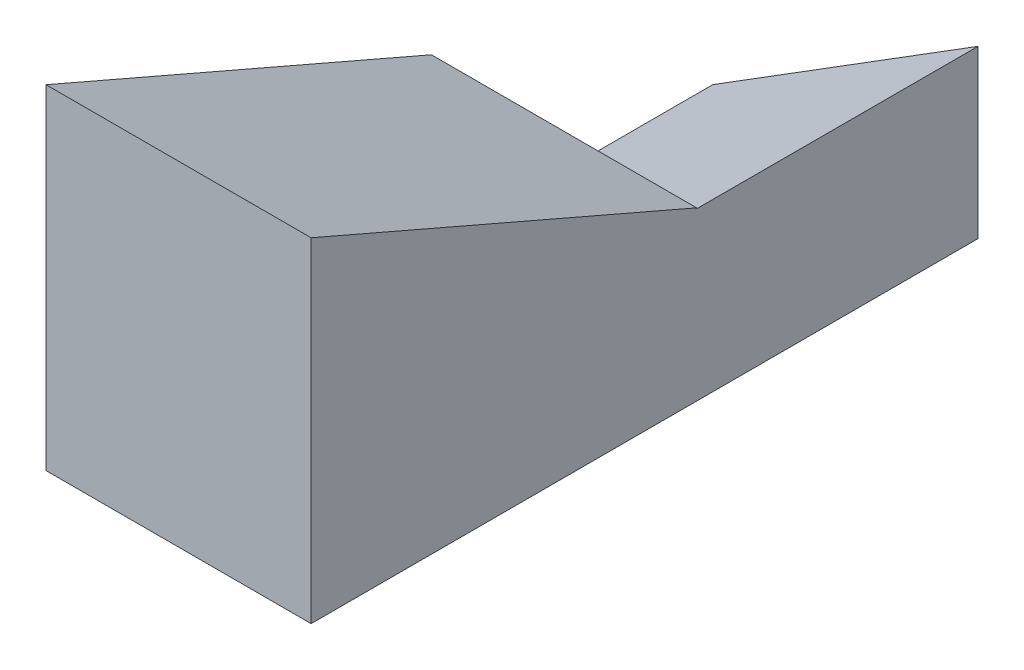
ISO-10303-21;
HEADER;
FILE_DESCRIPTION(('STEP AP214'),'2;1');
FILE_NAME('part.step','',(''),(''),'','','');
FILE_SCHEMA(('AUTOMOTIVE_DESIGN { 1 0 10303 214 1 1 1 1 }'));
ENDSEC;
DATA;
#1=APPLICATION_CONTEXT('core data for automotive mechanical design processes');
#2=APPLICATION_PROTOCOL_DEFINITION('international standard','automotive_design',2000,#1);
#3=PRODUCT_CONTEXT('',#1,'mechanical');
#4=PRODUCT('Part','Part','',(#3));
#5=PRODUCT_RELATED_PRODUCT_CATEGORY('part','',(#4));
#6=PRODUCT_DEFINITION_FORMATION('','',#4);
#7=PRODUCT_DEFINITION_CONTEXT('part definition',#1,'design');
#8=PRODUCT_DEFINITION('design','',#6,#7);
#9=PRODUCT_DEFINITION_SHAPE('','',#8);
#10=(LENGTH_UNIT() NAMED_UNIT(*) SI_UNIT(.MILLI.,.METRE.));
#11=(NAMED_UNIT(*) PLANE_ANGLE_UNIT() SI_UNIT($,.RADIAN.));
#12=(NAMED_UNIT(*) SI_UNIT($,.STERADIAN.) SOLID_ANGLE_UNIT());
#13=UNCERTAINTY_MEASURE_WITH_UNIT(LENGTH_MEASURE(1.E-05),#10,'distance_accuracy_value','');
#14=(GEOMETRIC_REPRESENTATION_CONTEXT(3) GLOBAL_UNCERTAINTY_ASSIGNED_CONTEXT((#13)) GLOBAL_UNIT_ASSIGNED_CONTEXT((#10,
#11,#12)) REPRESENTATION_CONTEXT('',''));
#15=CARTESIAN_POINT('',(0.,0.,0.));
#16=DIRECTION('',(0.,0.,1.));
#17=DIRECTION('',(1.,0.,0.));
#18=AXIS2_PLACEMENT_3D('',#15,#16,#17);
#19=CARTESIAN_POINT('',(0.,0.,0.));
#20=DIRECTION('',(0.,1.,0.));
#21=DIRECTION('',(0.,0.,1.));
#22=AXIS2_PLACEMENT_3D('',#19,#20,#21);
#23=PLANE('',#22);
#24=DIRECTION('',(1.,0.,0.));
#25=VECTOR('',#24,1.);
#26=CARTESIAN_POINT('',(22.3,0.,-54.8000000000001));
#27=LINE('',#26,#25);
#28=CARTESIAN_POINT('',(-17.3,0.,-54.8000000000001));
#29=VERTEX_POINT('',#28);
#30=CARTESIAN_POINT('',(22.3,0.,-54.8000000000001));
#31=VERTEX_POINT('',#30);
#32=EDGE_CURVE('E116',#29,#31,#27,.T.);
#33=ORIENTED_EDGE('',*,*,#32,.T.);
#34=DIRECTION('',(0.,0.,1.));
#35=VECTOR('',#34,1.);
#36=CARTESIAN_POINT('',(22.3,0.,44.7999999999999));
#37=LINE('',#36,#35);
#38=CARTESIAN_POINT('',(22.3,0.,44.7999999999999));
#39=VERTEX_POINT('',#38);
#40=EDGE_CURVE('E114',#31,#39,#37,.T.);
#41=ORIENTED_EDGE('',*,*,#40,.T.);
#42=DIRECTION('',(-1.,0.,0.));
#43=VECTOR('',#42,1.);
#44=CARTESIAN_POINT('',(-17.3,0.,44.7999999999999));
#45=LINE('',#44,#43);
#46=CARTESIAN_POINT('',(-17.3,0.,44.7999999999999));
#47=VERTEX_POINT('',#46);
#48=EDGE_CURVE('E63',#39,#47,#45,.T.);
#49=ORIENTED_EDGE('',*,*,#48,.T.);
#50=DIRECTION('',(0.,0.,-1.));
#51=VECTOR('',#50,1.);
#52=CARTESIAN_POINT('',(-17.3,0.,-54.8000000000001));
#53=LINE('',#52,#51);
#54=EDGE_CURVE('E104',#47,#29,#53,.T.);
#55=ORIENTED_EDGE('',*,*,#54,.T.);
#56=EDGE_LOOP('',(#33,#41,#49,#55));
#57=FACE_BOUND('',#56,.T.);
#58=ADVANCED_FACE('F38',(#57),#23,.F.);
#59=CARTESIAN_POINT('',(22.3,50.,-54.8000000000001));
#60=DIRECTION('',(0.,0.,-1.));
#61=DIRECTION('',(-1.,0.,0.));
#62=AXIS2_PLACEMENT_3D('',#59,#60,#61);
#63=PLANE('',#62);
#64=DIRECTION('',(0.,-1.,0.));
#65=VECTOR('',#64,1.);
#66=CARTESIAN_POINT('',(22.3,50.,-54.8000000000001));
#67=LINE('',#66,#65);
#68=CARTESIAN_POINT('',(22.3,24.875,-54.8000000000001));
#69=VERTEX_POINT('',#68);
#70=EDGE_CURVE('E110',#69,#31,#67,.T.);
#71=ORIENTED_EDGE('',*,*,#70,.T.);
#72=ORIENTED_EDGE('',*,*,#32,.F.);
#73=DIRECTION('',(0.,-1.,0.));
#74=VECTOR('',#73,1.);
#75=CARTESIAN_POINT('',(-17.3,50.,-54.8000000000001));
#76=LINE('',#75,#74);
#77=CARTESIAN_POINT('',(-17.3,0.125,-54.8000000000001));
#78=VERTEX_POINT('',#77);
#79=EDGE_CURVE('E100',#78,#29,#76,.T.);
#80=ORIENTED_EDGE('',*,*,#79,.F.);
#81=DIRECTION('',(-0.847998304005088,-0.52999894000318,0.));
#82=VECTOR('',#81,1.);
#83=CARTESIAN_POINT('',(-4.91573033707866,7.86516853932586,-54.8000000000001));
#84=LINE('',#83,#82);
#85=EDGE_CURVE('E135',#69,#78,#84,.T.);
#86=ORIENTED_EDGE('',*,*,#85,.F.);
#87=EDGE_LOOP('',(#71,#72,#80,#86));
#88=FACE_BOUND('',#87,.T.);
#89=ADVANCED_FACE('F161',(#88),#63,.T.);
#90=CARTESIAN_POINT('',(-17.3,50.,-54.8000000000001));
#91=DIRECTION('',(-1.,0.,0.));
#92=DIRECTION('',(0.,0.,1.));
#93=AXIS2_PLACEMENT_3D('',#90,#91,#92);
#94=PLANE('',#93);
#95=DIRECTION('',(0.,1.,0.));
#96=VECTOR('',#95,1.);
#97=CARTESIAN_POINT('',(-17.3,0.,-12.7716000000001));
#98=LINE('',#97,#96);
#99=CARTESIAN_POINT('',(-17.3,0.124999999999998,-12.7716000000001));
#100=VERTEX_POINT('',#99);
#101=CARTESIAN_POINT('',(-17.3,25.,-12.7716000000001));
#102=VERTEX_POINT('',#101);
#103=EDGE_CURVE('E137',#100,#102,#98,.T.);
#104=ORIENTED_EDGE('',*,*,#103,.F.);
#105=DIRECTION('',(0.,0.,1.));
#106=VECTOR('',#105,1.);
#107=CARTESIAN_POINT('',(-17.3,0.124999999999998,-12.7716000000001));
#108=LINE('',#107,#106);
#109=EDGE_CURVE('E136',#78,#100,#108,.T.);
#110=ORIENTED_EDGE('',*,*,#109,.F.);
#111=ORIENTED_EDGE('',*,*,#79,.T.);
#112=ORIENTED_EDGE('',*,*,#54,.F.);
#113=DIRECTION('',(0.,-1.,0.));
#114=VECTOR('',#113,1.);
#115=CARTESIAN_POINT('',(-17.3,50.,44.7999999999999));
#116=LINE('',#115,#114);
#117=CARTESIAN_POINT('',(-17.3,49.9134522715504,44.7999999999999));
#118=VERTEX_POINT('',#117);
#119=EDGE_CURVE('E93',#118,#47,#116,.T.);
#120=ORIENTED_EDGE('',*,*,#119,.F.);
#121=DIRECTION('',(0.,-0.397147890634787,-0.917754625683979));
#122=VECTOR('',#121,1.);
#123=CARTESIAN_POINT('',(-17.3,24.9786670611837,-12.8208888600001));
#124=LINE('',#123,#122);
#125=EDGE_CURVE('E132',#102,#118,#124,.F.);
#126=ORIENTED_EDGE('',*,*,#125,.F.);
#127=EDGE_LOOP('',(#104,#110,#111,#112,#120,#126));
#128=FACE_BOUND('',#127,.T.);
#129=ADVANCED_FACE('F105',(#128),#94,.T.);
#130=CARTESIAN_POINT('',(-17.3,50.,44.7999999999999));
#131=DIRECTION('',(0.,0.,1.));
#132=DIRECTION('',(1.,0.,0.));
#133=AXIS2_PLACEMENT_3D('',#130,#131,#132);
#134=PLANE('',#133);
#135=ORIENTED_EDGE('',*,*,#119,.T.);
#136=ORIENTED_EDGE('',*,*,#48,.F.);
#137=DIRECTION('',(0.,-1.,0.));
#138=VECTOR('',#137,1.);
#139=CARTESIAN_POINT('',(22.3,50.,44.7999999999999));
#140=LINE('',#139,#138);
#141=CARTESIAN_POINT('',(22.3,49.9134522715505,44.7999999999999));
#142=VERTEX_POINT('',#141);
#143=EDGE_CURVE('E101',#142,#39,#140,.T.);
#144=ORIENTED_EDGE('',*,*,#143,.F.);
#145=DIRECTION('',(-1.,0.,0.));
#146=VECTOR('',#145,1.);
#147=CARTESIAN_POINT('',(0.,49.9134522715504,44.7999999999999));
#148=LINE('',#147,#146);
#149=EDGE_CURVE('E97',#118,#142,#148,.F.);
#150=ORIENTED_EDGE('',*,*,#149,.F.);
#151=EDGE_LOOP('',(#135,#136,#144,#150));
#152=FACE_BOUND('',#151,.T.);
#153=ADVANCED_FACE('F95',(#152),#134,.T.);
#154=CARTESIAN_POINT('',(22.3,50.,44.7999999999999));
#155=DIRECTION('',(1.,0.,0.));
#156=DIRECTION('',(0.,0.,-1.));
#157=AXIS2_PLACEMENT_3D('',#154,#155,#156);
#158=PLANE('',#157);
#159=ORIENTED_EDGE('',*,*,#143,.T.);
#160=ORIENTED_EDGE('',*,*,#40,.F.);
#161=ORIENTED_EDGE('',*,*,#70,.F.);
#162=DIRECTION('',(0.,0.,-1.));
#163=VECTOR('',#162,1.);
#164=CARTESIAN_POINT('',(22.3,24.875,-12.7716000000001));
#165=LINE('',#164,#163);
#166=CARTESIAN_POINT('',(22.3,24.875,-12.7716000000001));
#167=VERTEX_POINT('',#166);
#168=EDGE_CURVE('E55',#167,#69,#165,.T.);
#169=ORIENTED_EDGE('',*,*,#168,.F.);
#170=DIRECTION('',(0.,-1.,0.));
#171=VECTOR('',#170,1.);
#172=CARTESIAN_POINT('',(22.3,0.,-12.7716000000001));
#173=LINE('',#172,#171);
#174=CARTESIAN_POINT('',(22.3,25.,-12.7716000000001));
#175=VERTEX_POINT('',#174);
#176=EDGE_CURVE('E120',#175,#167,#173,.T.);
#177=ORIENTED_EDGE('',*,*,#176,.F.);
#178=DIRECTION('',(0.,0.397147890634787,0.917754625683979));
#179=VECTOR('',#178,1.);
#180=CARTESIAN_POINT('',(22.3,24.9786670611837,-12.8208888600001));
#181=LINE('',#180,#179);
#182=EDGE_CURVE('E130',#142,#175,#181,.F.);
#183=ORIENTED_EDGE('',*,*,#182,.F.);
#184=EDGE_LOOP('',(#159,#160,#161,#169,#177,#183));
#185=FACE_BOUND('',#184,.T.);
#186=ADVANCED_FACE('F155',(#185),#158,.T.);
#187=CARTESIAN_POINT('',(0.,24.9786670611837,-12.8208888600001));
#188=DIRECTION('',(0.,-0.917754625683978,0.397147890634787));
#189=DIRECTION('',(1.,0.,0.));
#190=AXIS2_PLACEMENT_3D('',#187,#188,#189);
#191=PLANE('',#190);
#192=DIRECTION('',(-1.,0.,0.));
#193=VECTOR('',#192,1.);
#194=CARTESIAN_POINT('',(0.,25.,-12.7715913470591));
#195=LINE('',#194,#193);
#196=EDGE_CURVE('E11',#102,#175,#195,.F.);
#197=ORIENTED_EDGE('',*,*,#196,.F.);
#198=ORIENTED_EDGE('',*,*,#125,.T.);
#199=ORIENTED_EDGE('',*,*,#149,.T.);
#200=ORIENTED_EDGE('',*,*,#182,.T.);
#201=EDGE_LOOP('',(#197,#198,#199,#200));
#202=FACE_BOUND('',#201,.T.);
#203=ADVANCED_FACE('F41',(#202),#191,.F.);
#204=CARTESIAN_POINT('',(-4.91573033707866,7.86516853932586,-12.7716000000001));
#205=DIRECTION('',(-0.52999894000318,0.847998304005088,0.));
#206=DIRECTION('',(-0.847998304005088,-0.52999894000318,0.));
#207=AXIS2_PLACEMENT_3D('',#204,#205,#206);
#208=PLANE('',#207);
#209=ORIENTED_EDGE('',*,*,#85,.T.);
#210=ORIENTED_EDGE('',*,*,#109,.T.);
#211=DIRECTION('',(0.847998304005088,0.52999894000318,0.));
#212=VECTOR('',#211,1.);
#213=CARTESIAN_POINT('',(-4.91573033707866,7.86516853932586,-12.7716000000001));
#214=LINE('',#213,#212);
#215=EDGE_CURVE('E48',#100,#167,#214,.T.);
#216=ORIENTED_EDGE('',*,*,#215,.T.);
#217=ORIENTED_EDGE('',*,*,#168,.T.);
#218=EDGE_LOOP('',(#209,#210,#216,#217));
#219=FACE_BOUND('',#218,.T.);
#220=ADVANCED_FACE('F149',(#219),#208,.T.);
#221=CARTESIAN_POINT('',(0.,0.,-12.7716000000001));
#222=DIRECTION('',(0.,0.,-1.));
#223=DIRECTION('',(-1.,0.,0.));
#224=AXIS2_PLACEMENT_3D('',#221,#222,#223);
#225=PLANE('',#224);
#226=ORIENTED_EDGE('',*,*,#215,.F.);
#227=ORIENTED_EDGE('',*,*,#103,.T.);
#228=ORIENTED_EDGE('',*,*,#196,.T.);
#229=ORIENTED_EDGE('',*,*,#176,.T.);
#230=EDGE_LOOP('',(#226,#227,#228,#229));
#231=FACE_BOUND('',#230,.T.);
#232=ADVANCED_FACE('F152',(#231),#225,.T.);
#233=CLOSED_SHELL('',(#58,#89,#129,#153,#186,#203,#220,#232));
#234=MANIFOLD_SOLID_BREP('B2',#233);
#235=ADVANCED_BREP_SHAPE_REPRESENTATION('',(#18,#234),#14);
#236=SHAPE_DEFINITION_REPRESENTATION(#9,#235);
ENDSEC;
END-ISO-10303-21;
